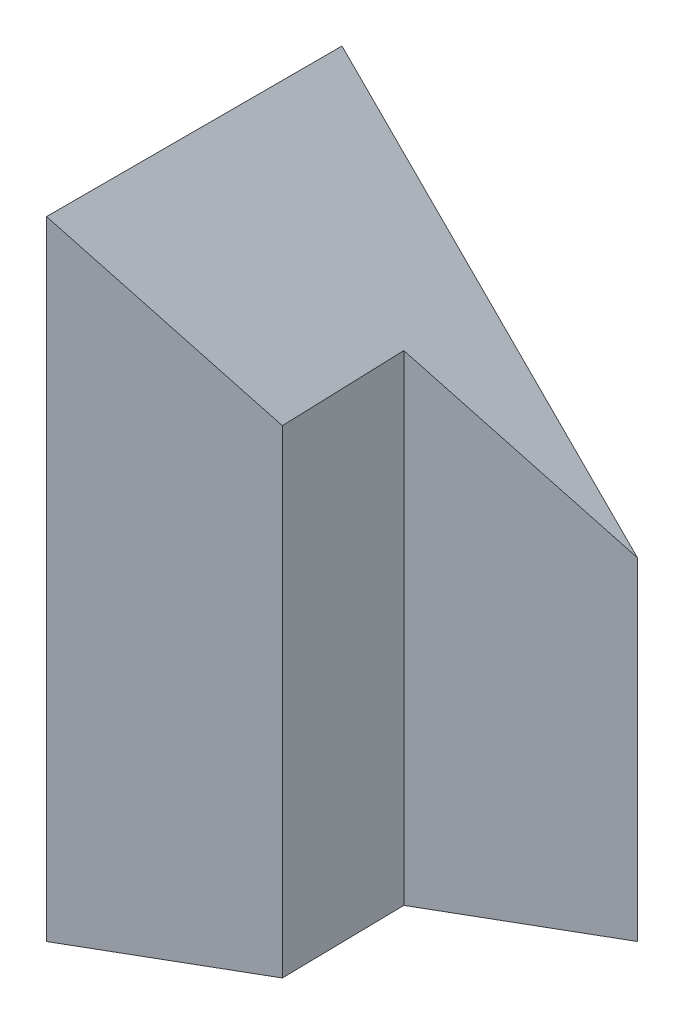
ISO-10303-21;
HEADER;
FILE_DESCRIPTION(('STEP AP214'),'2;1');
FILE_NAME('part.step','',(''),(''),'','','');
FILE_SCHEMA(('AUTOMOTIVE_DESIGN { 1 0 10303 214 1 1 1 1 }'));
ENDSEC;
DATA;
#1=APPLICATION_CONTEXT('core data for automotive mechanical design processes');
#2=APPLICATION_PROTOCOL_DEFINITION('international standard','automotive_design',2000,#1);
#3=PRODUCT_CONTEXT('',#1,'mechanical');
#4=PRODUCT('Part','Part','',(#3));
#5=PRODUCT_RELATED_PRODUCT_CATEGORY('part','',(#4));
#6=PRODUCT_DEFINITION_FORMATION('','',#4);
#7=PRODUCT_DEFINITION_CONTEXT('part definition',#1,'design');
#8=PRODUCT_DEFINITION('design','',#6,#7);
#9=PRODUCT_DEFINITION_SHAPE('','',#8);
#10=(LENGTH_UNIT() NAMED_UNIT(*) SI_UNIT(.MILLI.,.METRE.));
#11=(NAMED_UNIT(*) PLANE_ANGLE_UNIT() SI_UNIT($,.RADIAN.));
#12=(NAMED_UNIT(*) SI_UNIT($,.STERADIAN.) SOLID_ANGLE_UNIT());
#13=UNCERTAINTY_MEASURE_WITH_UNIT(LENGTH_MEASURE(1.E-05),#10,'distance_accuracy_value','');
#14=(GEOMETRIC_REPRESENTATION_CONTEXT(3) GLOBAL_UNCERTAINTY_ASSIGNED_CONTEXT((#13)) GLOBAL_UNIT_ASSIGNED_CONTEXT((#10,
#11,#12)) REPRESENTATION_CONTEXT('',''));
#15=CARTESIAN_POINT('',(0.,0.,0.));
#16=DIRECTION('',(0.,0.,1.));
#17=DIRECTION('',(1.,0.,0.));
#18=AXIS2_PLACEMENT_3D('',#15,#16,#17);
#19=CARTESIAN_POINT('',(-0.370757644227551,107.95,-3.888893086734));
#20=DIRECTION('',(-0.499999999999995,0.,-0.866025403784442));
#21=DIRECTION('',(-0.866025403784442,0.,0.499999999999995));
#22=AXIS2_PLACEMENT_3D('',#19,#20,#21);
#23=PLANE('',#22);
#24=DIRECTION('',(0.654653670707979,-0.654653670707977,-0.377964473009223));
#25=VECTOR('',#24,1.);
#26=CARTESIAN_POINT('',(-11.2287289808668,93.472704884481,2.37995958732785));
#27=LINE('',#26,#25);
#28=CARTESIAN_POINT('',(-0.370757644227551,82.6147335478417,-3.88889308673399));
#29=VERTEX_POINT('',#28);
#30=CARTESIAN_POINT('',(25.0939759036141,57.1500000000002,-18.5909638554223));
#31=VERTEX_POINT('',#30);
#32=EDGE_CURVE('E96',#29,#31,#27,.T.);
#33=ORIENTED_EDGE('',*,*,#32,.F.);
#34=DIRECTION('',(0.,-1.,0.));
#35=VECTOR('',#34,1.);
#36=CARTESIAN_POINT('',(-0.370757644227551,107.95,-3.888893086734));
#37=LINE('',#36,#35);
#38=CARTESIAN_POINT('',(-0.370757644227551,0.,-3.888893086734));
#39=VERTEX_POINT('',#38);
#40=EDGE_CURVE('E100',#29,#39,#37,.T.);
#41=ORIENTED_EDGE('',*,*,#40,.T.);
#42=DIRECTION('',(0.866025403784442,0.,-0.499999999999995));
#43=VECTOR('',#42,1.);
#44=CARTESIAN_POINT('',(-0.370757644227551,0.,-3.888893086734));
#45=LINE('',#44,#43);
#46=CARTESIAN_POINT('',(25.0939759036141,0.,-18.5909638554223));
#47=VERTEX_POINT('',#46);
#48=EDGE_CURVE('E110',#39,#47,#45,.T.);
#49=ORIENTED_EDGE('',*,*,#48,.T.);
#50=DIRECTION('',(0.,-1.,0.));
#51=VECTOR('',#50,1.);
#52=CARTESIAN_POINT('',(25.0939759036141,107.95,-18.5909638554223));
#53=LINE('',#52,#51);
#54=EDGE_CURVE('E11',#31,#47,#53,.T.);
#55=ORIENTED_EDGE('',*,*,#54,.F.);
#56=EDGE_LOOP('',(#33,#41,#49,#55));
#57=FACE_BOUND('',#56,.T.);
#58=ADVANCED_FACE('F33',(#57),#23,.F.);
#59=CARTESIAN_POINT('',(25.0939759036141,107.95,-18.5909638554223));
#60=DIRECTION('',(0.,0.,1.));
#61=DIRECTION('',(1.,0.,0.));
#62=AXIS2_PLACEMENT_3D('',#59,#60,#61);
#63=PLANE('',#62);
#64=DIRECTION('',(-0.707106781186549,0.707106781186546,0.));
#65=VECTOR('',#64,1.);
#66=CARTESIAN_POINT('',(-0.306024096385804,82.55,-18.5909638554223));
#67=LINE('',#66,#65);
#68=CARTESIAN_POINT('',(-25.7060240963859,107.95,-18.5909638554223));
#69=VERTEX_POINT('',#68);
#70=EDGE_CURVE('E46',#31,#69,#67,.T.);
#71=ORIENTED_EDGE('',*,*,#70,.F.);
#72=ORIENTED_EDGE('',*,*,#54,.T.);
#73=DIRECTION('',(-1.,0.,0.));
#74=VECTOR('',#73,1.);
#75=CARTESIAN_POINT('',(25.0939759036141,0.,-18.5909638554223));
#76=LINE('',#75,#74);
#77=CARTESIAN_POINT('',(-25.7060240963859,0.,-18.5909638554223));
#78=VERTEX_POINT('',#77);
#79=EDGE_CURVE('E113',#47,#78,#76,.T.);
#80=ORIENTED_EDGE('',*,*,#79,.T.);
#81=DIRECTION('',(0.,-1.,0.));
#82=VECTOR('',#81,1.);
#83=CARTESIAN_POINT('',(-25.7060240963859,107.95,-18.5909638554223));
#84=LINE('',#83,#82);
#85=EDGE_CURVE('E40',#69,#78,#84,.T.);
#86=ORIENTED_EDGE('',*,*,#85,.F.);
#87=EDGE_LOOP('',(#71,#72,#80,#86));
#88=FACE_BOUND('',#87,.T.);
#89=ADVANCED_FACE('F125',(#88),#63,.F.);
#90=CARTESIAN_POINT('',(-25.7060240963859,107.95,32.2090361445777));
#91=DIRECTION('',(-0.500000000000004,0.,-0.866025403784436));
#92=DIRECTION('',(-0.866025403784436,0.,0.500000000000004));
#93=AXIS2_PLACEMENT_3D('',#90,#91,#92);
#94=PLANE('',#93);
#95=DIRECTION('',(0.654653670707977,-0.654653670707975,-0.377964473009232));
#96=VECTOR('',#95,1.);
#97=CARTESIAN_POINT('',(-25.7060240963859,107.95,32.2090361445777));
#98=LINE('',#97,#96);
#99=CARTESIAN_POINT('',(-25.7060240963859,107.95,32.2090361445777));
#100=VERTEX_POINT('',#99);
#101=CARTESIAN_POINT('',(0.000274042232694598,82.2437018613815,17.3674979943773));
#102=VERTEX_POINT('',#101);
#103=EDGE_CURVE('E93',#100,#102,#98,.T.);
#104=ORIENTED_EDGE('',*,*,#103,.F.);
#105=DIRECTION('',(0.,-1.,0.));
#106=VECTOR('',#105,1.);
#107=CARTESIAN_POINT('',(-25.7060240963859,107.95,32.2090361445777));
#108=LINE('',#107,#106);
#109=CARTESIAN_POINT('',(-25.7060240963859,0.,32.2090361445777));
#110=VERTEX_POINT('',#109);
#111=EDGE_CURVE('E79',#100,#110,#108,.T.);
#112=ORIENTED_EDGE('',*,*,#111,.T.);
#113=DIRECTION('',(0.866025403784436,0.,-0.500000000000004));
#114=VECTOR('',#113,1.);
#115=CARTESIAN_POINT('',(-25.7060240963859,0.,32.2090361445777));
#116=LINE('',#115,#114);
#117=CARTESIAN_POINT('',(0.000274042232694585,0.,17.3674979943773));
#118=VERTEX_POINT('',#117);
#119=EDGE_CURVE('E105',#110,#118,#116,.T.);
#120=ORIENTED_EDGE('',*,*,#119,.T.);
#121=DIRECTION('',(0.,-1.,0.));
#122=VECTOR('',#121,1.);
#123=CARTESIAN_POINT('',(0.000274042232694585,107.95,17.3674979943773));
#124=LINE('',#123,#122);
#125=EDGE_CURVE('E90',#102,#118,#124,.T.);
#126=ORIENTED_EDGE('',*,*,#125,.F.);
#127=EDGE_LOOP('',(#104,#112,#120,#126));
#128=FACE_BOUND('',#127,.T.);
#129=ADVANCED_FACE('F94',(#128),#94,.F.);
#130=CARTESIAN_POINT('',(0.000274042232694585,107.95,17.3674979943773));
#131=DIRECTION('',(-0.999847695156391,0.,0.017452406437277));
#132=DIRECTION('',(0.017452406437277,0.,0.999847695156391));
#133=AXIS2_PLACEMENT_3D('',#130,#131,#132);
#134=PLANE('',#133);
#135=DIRECTION('',(-0.0174497491606762,0.0174497491606761,-0.999695459881888));
#136=VECTOR('',#135,1.);
#137=CARTESIAN_POINT('',(-0.00755336477742706,82.2515292683916,16.919066147099));
#138=LINE('',#137,#136);
#139=EDGE_CURVE('E54',#102,#29,#138,.T.);
#140=ORIENTED_EDGE('',*,*,#139,.F.);
#141=ORIENTED_EDGE('',*,*,#125,.T.);
#142=DIRECTION('',(-0.017452406437277,0.,-0.999847695156391));
#143=VECTOR('',#142,1.);
#144=CARTESIAN_POINT('',(0.000274042232694585,0.,17.3674979943773));
#145=LINE('',#144,#143);
#146=EDGE_CURVE('E101',#118,#39,#145,.T.);
#147=ORIENTED_EDGE('',*,*,#146,.T.);
#148=ORIENTED_EDGE('',*,*,#40,.F.);
#149=EDGE_LOOP('',(#140,#141,#147,#148));
#150=FACE_BOUND('',#149,.T.);
#151=ADVANCED_FACE('F122',(#150),#134,.F.);
#152=CARTESIAN_POINT('',(-25.7060240963859,107.95,-18.5909638554223));
#153=DIRECTION('',(1.,0.,0.));
#154=DIRECTION('',(0.,0.,-1.));
#155=AXIS2_PLACEMENT_3D('',#152,#153,#154);
#156=PLANE('',#155);
#157=DIRECTION('',(0.,0.,1.));
#158=VECTOR('',#157,1.);
#159=CARTESIAN_POINT('',(-25.7060240963859,0.,-18.5909638554223));
#160=LINE('',#159,#158);
#161=EDGE_CURVE('E86',#78,#110,#160,.T.);
#162=ORIENTED_EDGE('',*,*,#161,.T.);
#163=ORIENTED_EDGE('',*,*,#111,.F.);
#164=DIRECTION('',(0.,0.,1.));
#165=VECTOR('',#164,1.);
#166=CARTESIAN_POINT('',(-25.7060240963859,107.95,-18.5909638554223));
#167=LINE('',#166,#165);
#168=EDGE_CURVE('E84',#69,#100,#167,.T.);
#169=ORIENTED_EDGE('',*,*,#168,.F.);
#170=ORIENTED_EDGE('',*,*,#85,.T.);
#171=EDGE_LOOP('',(#162,#163,#169,#170));
#172=FACE_BOUND('',#171,.T.);
#173=ADVANCED_FACE('F81',(#172),#156,.F.);
#174=CARTESIAN_POINT('',(0.,0.,0.));
#175=DIRECTION('',(0.,1.,0.));
#176=DIRECTION('',(0.,0.,1.));
#177=AXIS2_PLACEMENT_3D('',#174,#175,#176);
#178=PLANE('',#177);
#179=ORIENTED_EDGE('',*,*,#48,.F.);
#180=ORIENTED_EDGE('',*,*,#146,.F.);
#181=ORIENTED_EDGE('',*,*,#119,.F.);
#182=ORIENTED_EDGE('',*,*,#161,.F.);
#183=ORIENTED_EDGE('',*,*,#79,.F.);
#184=EDGE_LOOP('',(#179,#180,#181,#182,#183));
#185=FACE_BOUND('',#184,.T.);
#186=ADVANCED_FACE('F120',(#185),#178,.F.);
#187=CARTESIAN_POINT('',(-25.7060240963859,107.95,185.327041556534));
#188=DIRECTION('',(0.707106781186546,0.707106781186549,0.));
#189=DIRECTION('',(-0.707106781186549,0.707106781186546,0.));
#190=AXIS2_PLACEMENT_3D('',#187,#188,#189);
#191=PLANE('',#190);
#192=ORIENTED_EDGE('',*,*,#32,.T.);
#193=ORIENTED_EDGE('',*,*,#70,.T.);
#194=ORIENTED_EDGE('',*,*,#168,.T.);
#195=ORIENTED_EDGE('',*,*,#103,.T.);
#196=ORIENTED_EDGE('',*,*,#139,.T.);
#197=EDGE_LOOP('',(#192,#193,#194,#195,#196));
#198=FACE_BOUND('',#197,.T.);
#199=ADVANCED_FACE('F99',(#198),#191,.T.);
#200=CLOSED_SHELL('',(#58,#89,#129,#151,#173,#186,#199));
#201=MANIFOLD_SOLID_BREP('B2',#200);
#202=ADVANCED_BREP_SHAPE_REPRESENTATION('',(#18,#201),#14);
#203=SHAPE_DEFINITION_REPRESENTATION(#9,#202);
ENDSEC;
END-ISO-10303-21;
